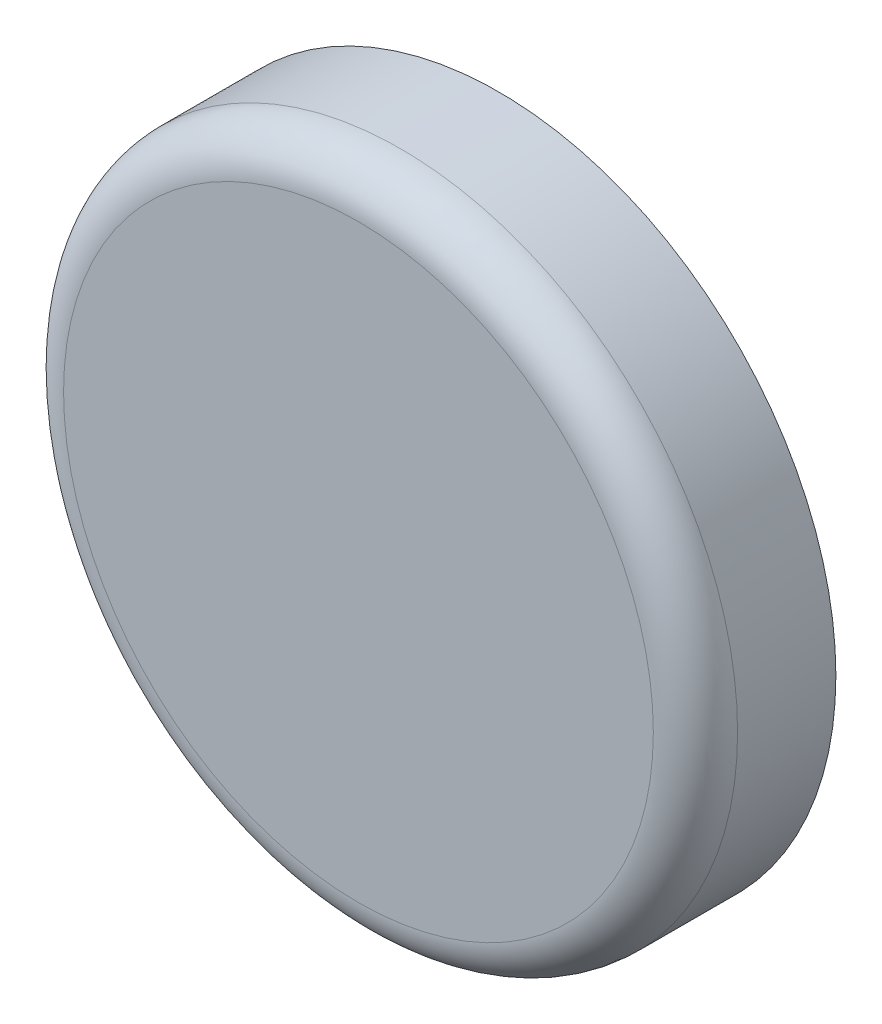
ISO-10303-21;
HEADER;
FILE_DESCRIPTION(('STEP AP214'),'2;1');
FILE_NAME('part.step','',(''),(''),'','','');
FILE_SCHEMA(('AUTOMOTIVE_DESIGN { 1 0 10303 214 1 1 1 1 }'));
ENDSEC;
DATA;
#1=APPLICATION_CONTEXT('core data for automotive mechanical design processes');
#2=APPLICATION_PROTOCOL_DEFINITION('international standard','automotive_design',2000,#1);
#3=PRODUCT_CONTEXT('',#1,'mechanical');
#4=PRODUCT('Part','Part','',(#3));
#5=PRODUCT_RELATED_PRODUCT_CATEGORY('part','',(#4));
#6=PRODUCT_DEFINITION_FORMATION('','',#4);
#7=PRODUCT_DEFINITION_CONTEXT('part definition',#1,'design');
#8=PRODUCT_DEFINITION('design','',#6,#7);
#9=PRODUCT_DEFINITION_SHAPE('','',#8);
#10=(LENGTH_UNIT() NAMED_UNIT(*) SI_UNIT(.MILLI.,.METRE.));
#11=(NAMED_UNIT(*) PLANE_ANGLE_UNIT() SI_UNIT($,.RADIAN.));
#12=(NAMED_UNIT(*) SI_UNIT($,.STERADIAN.) SOLID_ANGLE_UNIT());
#13=UNCERTAINTY_MEASURE_WITH_UNIT(LENGTH_MEASURE(1.E-05),#10,'distance_accuracy_value','');
#14=(GEOMETRIC_REPRESENTATION_CONTEXT(3) GLOBAL_UNCERTAINTY_ASSIGNED_CONTEXT((#13)) GLOBAL_UNIT_ASSIGNED_CONTEXT((#10,
#11,#12)) REPRESENTATION_CONTEXT('',''));
#15=CARTESIAN_POINT('',(0.,0.,0.));
#16=DIRECTION('',(0.,0.,1.));
#17=DIRECTION('',(1.,0.,0.));
#18=AXIS2_PLACEMENT_3D('',#15,#16,#17);
#19=CARTESIAN_POINT('',(0.,0.,2.5));
#20=DIRECTION('',(0.,0.,-1.));
#21=DIRECTION('',(-1.,0.,0.));
#22=AXIS2_PLACEMENT_3D('',#19,#20,#21);
#23=PLANE('',#22);
#24=CARTESIAN_POINT('',(0.,0.,2.5));
#25=DIRECTION('',(0.,0.,-1.));
#26=DIRECTION('',(-1.,0.,0.));
#27=AXIS2_PLACEMENT_3D('',#24,#25,#26);
#28=CIRCLE('',#27,5.25);
#29=CARTESIAN_POINT('',(-5.25,0.,2.5));
#30=VERTEX_POINT('',#29);
#31=CARTESIAN_POINT('',(5.25,0.,2.5));
#32=VERTEX_POINT('',#31);
#33=EDGE_CURVE('E39',#30,#32,#28,.T.);
#34=ORIENTED_EDGE('',*,*,#33,.F.);
#35=CARTESIAN_POINT('',(0.,0.,2.5));
#36=DIRECTION('',(0.,0.,-1.));
#37=DIRECTION('',(1.,0.,0.));
#38=AXIS2_PLACEMENT_3D('',#35,#36,#37);
#39=CIRCLE('',#38,5.25);
#40=EDGE_CURVE('E33',#32,#30,#39,.T.);
#41=ORIENTED_EDGE('',*,*,#40,.F.);
#42=EDGE_LOOP('',(#34,#41));
#43=FACE_BOUND('',#42,.T.);
#44=ADVANCED_FACE('F16',(#43),#23,.F.);
#45=CARTESIAN_POINT('',(0.,0.,1.75));
#46=DIRECTION('',(0.,0.,-1.));
#47=DIRECTION('',(-1.,0.,0.));
#48=AXIS2_PLACEMENT_3D('',#45,#46,#47);
#49=TOROIDAL_SURFACE('',#48,5.25,0.75);
#50=ORIENTED_EDGE('',*,*,#40,.T.);
#51=ORIENTED_EDGE('',*,*,#33,.T.);
#52=EDGE_LOOP('',(#50,#51));
#53=FACE_BOUND('',#52,.T.);
#54=CARTESIAN_POINT('',(0.,0.,1.75));
#55=DIRECTION('',(0.,0.,1.));
#56=DIRECTION('',(1.,0.,0.));
#57=AXIS2_PLACEMENT_3D('',#54,#55,#56);
#58=CIRCLE('',#57,6.);
#59=CARTESIAN_POINT('',(6.,0.,1.75));
#60=VERTEX_POINT('',#59);
#61=EDGE_CURVE('E26',#60,#60,#58,.F.);
#62=ORIENTED_EDGE('',*,*,#61,.F.);
#63=EDGE_LOOP('',(#62));
#64=FACE_BOUND('',#63,.T.);
#65=ADVANCED_FACE('F37',(#53,#64),#49,.T.);
#66=CARTESIAN_POINT('',(0.,0.,0.));
#67=DIRECTION('',(0.,0.,1.));
#68=DIRECTION('',(1.,0.,0.));
#69=AXIS2_PLACEMENT_3D('',#66,#67,#68);
#70=CYLINDRICAL_SURFACE('',#69,6.);
#71=ORIENTED_EDGE('',*,*,#61,.T.);
#72=EDGE_LOOP('',(#71));
#73=FACE_BOUND('',#72,.T.);
#74=CARTESIAN_POINT('',(0.,0.,0.));
#75=DIRECTION('',(0.,0.,1.));
#76=DIRECTION('',(1.,0.,0.));
#77=AXIS2_PLACEMENT_3D('',#74,#75,#76);
#78=CIRCLE('',#77,6.);
#79=CARTESIAN_POINT('',(6.,0.,0.));
#80=VERTEX_POINT('',#79);
#81=EDGE_CURVE('E11',#80,#80,#78,.F.);
#82=ORIENTED_EDGE('',*,*,#81,.F.);
#83=EDGE_LOOP('',(#82));
#84=FACE_BOUND('',#83,.T.);
#85=ADVANCED_FACE('F72',(#73,#84),#70,.T.);
#86=CARTESIAN_POINT('',(0.,0.,0.));
#87=DIRECTION('',(0.,0.,-1.));
#88=DIRECTION('',(-1.,0.,0.));
#89=AXIS2_PLACEMENT_3D('',#86,#87,#88);
#90=PLANE('',#89);
#91=ORIENTED_EDGE('',*,*,#81,.T.);
#92=EDGE_LOOP('',(#91));
#93=FACE_BOUND('',#92,.T.);
#94=ADVANCED_FACE('F76',(#93),#90,.T.);
#95=CLOSED_SHELL('',(#44,#65,#85,#94));
#96=MANIFOLD_SOLID_BREP('B1',#95);
#97=ADVANCED_BREP_SHAPE_REPRESENTATION('',(#18,#96),#14);
#98=SHAPE_DEFINITION_REPRESENTATION(#9,#97);
ENDSEC;
END-ISO-10303-21;
